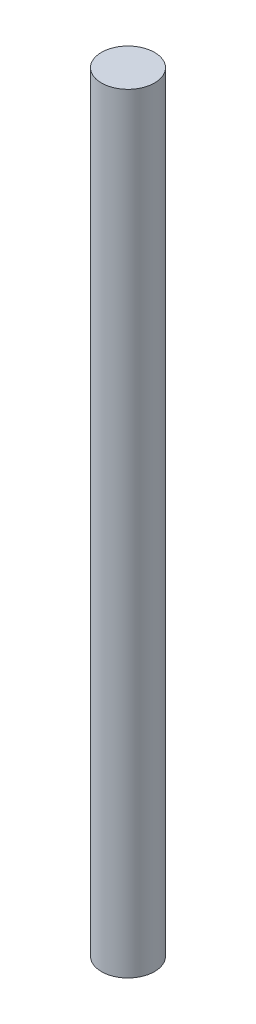
ISO-10303-21;
HEADER;
FILE_DESCRIPTION(('STEP AP214'),'2;1');
FILE_NAME('part.step','',(''),(''),'','','');
FILE_SCHEMA(('AUTOMOTIVE_DESIGN { 1 0 10303 214 1 1 1 1 }'));
ENDSEC;
DATA;
#1=APPLICATION_CONTEXT('core data for automotive mechanical design processes');
#2=APPLICATION_PROTOCOL_DEFINITION('international standard','automotive_design',2000,#1);
#3=PRODUCT_CONTEXT('',#1,'mechanical');
#4=PRODUCT('Part','Part','',(#3));
#5=PRODUCT_RELATED_PRODUCT_CATEGORY('part','',(#4));
#6=PRODUCT_DEFINITION_FORMATION('','',#4);
#7=PRODUCT_DEFINITION_CONTEXT('part definition',#1,'design');
#8=PRODUCT_DEFINITION('design','',#6,#7);
#9=PRODUCT_DEFINITION_SHAPE('','',#8);
#10=(LENGTH_UNIT() NAMED_UNIT(*) SI_UNIT(.MILLI.,.METRE.));
#11=(NAMED_UNIT(*) PLANE_ANGLE_UNIT() SI_UNIT($,.RADIAN.));
#12=(NAMED_UNIT(*) SI_UNIT($,.STERADIAN.) SOLID_ANGLE_UNIT());
#13=UNCERTAINTY_MEASURE_WITH_UNIT(LENGTH_MEASURE(1.E-05),#10,'distance_accuracy_value','');
#14=(GEOMETRIC_REPRESENTATION_CONTEXT(3) GLOBAL_UNCERTAINTY_ASSIGNED_CONTEXT((#13)) GLOBAL_UNIT_ASSIGNED_CONTEXT((#10,
#11,#12)) REPRESENTATION_CONTEXT('',''));
#15=CARTESIAN_POINT('',(0.,0.,0.));
#16=DIRECTION('',(0.,0.,1.));
#17=DIRECTION('',(1.,0.,0.));
#18=AXIS2_PLACEMENT_3D('',#15,#16,#17);
#19=CARTESIAN_POINT('',(0.,145.,0.));
#20=DIRECTION('',(0.,-1.,0.));
#21=DIRECTION('',(0.,0.,-1.));
#22=AXIS2_PLACEMENT_3D('',#19,#20,#21);
#23=CYLINDRICAL_SURFACE('',#22,5.);
#24=CARTESIAN_POINT('',(0.,145.,0.));
#25=DIRECTION('',(0.,1.,0.));
#26=DIRECTION('',(0.,0.,1.));
#27=AXIS2_PLACEMENT_3D('',#24,#25,#26);
#28=CIRCLE('',#27,5.);
#29=CARTESIAN_POINT('',(0.,145.,5.));
#30=VERTEX_POINT('',#29);
#31=EDGE_CURVE('E10',#30,#30,#28,.T.);
#32=ORIENTED_EDGE('',*,*,#31,.F.);
#33=EDGE_LOOP('',(#32));
#34=FACE_BOUND('',#33,.T.);
#35=CARTESIAN_POINT('',(0.,0.,0.));
#36=DIRECTION('',(0.,1.,0.));
#37=DIRECTION('',(0.,0.,1.));
#38=AXIS2_PLACEMENT_3D('',#35,#36,#37);
#39=CIRCLE('',#38,5.);
#40=CARTESIAN_POINT('',(0.,0.,5.));
#41=VERTEX_POINT('',#40);
#42=EDGE_CURVE('E40',#41,#41,#39,.T.);
#43=ORIENTED_EDGE('',*,*,#42,.T.);
#44=EDGE_LOOP('',(#43));
#45=FACE_BOUND('',#44,.T.);
#46=ADVANCED_FACE('F37',(#34,#45),#23,.T.);
#47=CARTESIAN_POINT('',(0.,145.,0.));
#48=DIRECTION('',(0.,1.,0.));
#49=DIRECTION('',(0.,0.,1.));
#50=AXIS2_PLACEMENT_3D('',#47,#48,#49);
#51=PLANE('',#50);
#52=ORIENTED_EDGE('',*,*,#31,.T.);
#53=EDGE_LOOP('',(#52));
#54=FACE_BOUND('',#53,.T.);
#55=ADVANCED_FACE('F54',(#54),#51,.T.);
#56=CARTESIAN_POINT('',(0.,0.,0.));
#57=DIRECTION('',(0.,1.,0.));
#58=DIRECTION('',(0.,0.,1.));
#59=AXIS2_PLACEMENT_3D('',#56,#57,#58);
#60=PLANE('',#59);
#61=ORIENTED_EDGE('',*,*,#42,.F.);
#62=EDGE_LOOP('',(#61));
#63=FACE_BOUND('',#62,.T.);
#64=ADVANCED_FACE('F52',(#63),#60,.F.);
#65=CLOSED_SHELL('',(#46,#55,#64));
#66=MANIFOLD_SOLID_BREP('B2',#65);
#67=ADVANCED_BREP_SHAPE_REPRESENTATION('',(#18,#66),#14);
#68=SHAPE_DEFINITION_REPRESENTATION(#9,#67);
ENDSEC;
END-ISO-10303-21;
